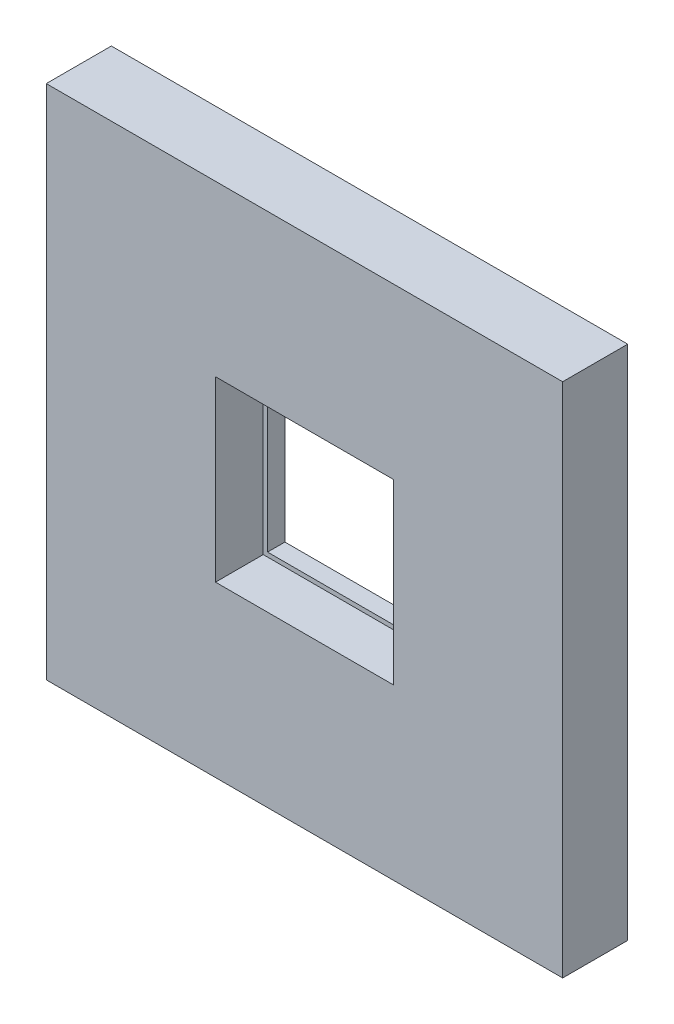
ISO-10303-21;
HEADER;
FILE_DESCRIPTION(('STEP AP214'),'2;1');
FILE_NAME('part.step','',(''),(''),'','','');
FILE_SCHEMA(('AUTOMOTIVE_DESIGN { 1 0 10303 214 1 1 1 1 }'));
ENDSEC;
DATA;
#1=APPLICATION_CONTEXT('core data for automotive mechanical design processes');
#2=APPLICATION_PROTOCOL_DEFINITION('international standard','automotive_design',2000,#1);
#3=PRODUCT_CONTEXT('',#1,'mechanical');
#4=PRODUCT('Part','Part','',(#3));
#5=PRODUCT_RELATED_PRODUCT_CATEGORY('part','',(#4));
#6=PRODUCT_DEFINITION_FORMATION('','',#4);
#7=PRODUCT_DEFINITION_CONTEXT('part definition',#1,'design');
#8=PRODUCT_DEFINITION('design','',#6,#7);
#9=PRODUCT_DEFINITION_SHAPE('','',#8);
#10=(LENGTH_UNIT() NAMED_UNIT(*) SI_UNIT(.MILLI.,.METRE.));
#11=(NAMED_UNIT(*) PLANE_ANGLE_UNIT() SI_UNIT($,.RADIAN.));
#12=(NAMED_UNIT(*) SI_UNIT($,.STERADIAN.) SOLID_ANGLE_UNIT());
#13=UNCERTAINTY_MEASURE_WITH_UNIT(LENGTH_MEASURE(1.E-05),#10,'distance_accuracy_value','');
#14=(GEOMETRIC_REPRESENTATION_CONTEXT(3) GLOBAL_UNCERTAINTY_ASSIGNED_CONTEXT((#13)) GLOBAL_UNIT_ASSIGNED_CONTEXT((#10,
#11,#12)) REPRESENTATION_CONTEXT('',''));
#15=CARTESIAN_POINT('',(0.,0.,0.));
#16=DIRECTION('',(0.,0.,1.));
#17=DIRECTION('',(1.,0.,0.));
#18=AXIS2_PLACEMENT_3D('',#15,#16,#17);
#19=CARTESIAN_POINT('',(-2.05,0.,0.4));
#20=DIRECTION('',(-1.,0.,0.));
#21=DIRECTION('',(0.,0.,1.));
#22=AXIS2_PLACEMENT_3D('',#19,#20,#21);
#23=PLANE('',#22);
#24=DIRECTION('',(0.,1.,0.));
#25=VECTOR('',#24,1.);
#26=CARTESIAN_POINT('',(-2.05,0.,0.));
#27=LINE('',#26,#25);
#28=CARTESIAN_POINT('',(-2.05,-2.05,0.));
#29=VERTEX_POINT('',#28);
#30=CARTESIAN_POINT('',(-2.05,2.05,0.));
#31=VERTEX_POINT('',#30);
#32=EDGE_CURVE('E169',#29,#31,#27,.T.);
#33=ORIENTED_EDGE('',*,*,#32,.F.);
#34=DIRECTION('',(0.,0.,-1.));
#35=VECTOR('',#34,1.);
#36=CARTESIAN_POINT('',(-2.05,-2.05,0.4));
#37=LINE('',#36,#35);
#38=CARTESIAN_POINT('',(-2.05,-2.05,0.4));
#39=VERTEX_POINT('',#38);
#40=EDGE_CURVE('E12',#39,#29,#37,.T.);
#41=ORIENTED_EDGE('',*,*,#40,.F.);
#42=DIRECTION('',(0.,1.,0.));
#43=VECTOR('',#42,1.);
#44=CARTESIAN_POINT('',(-2.05,0.,0.4));
#45=LINE('',#44,#43);
#46=CARTESIAN_POINT('',(-2.05,2.05,0.4));
#47=VERTEX_POINT('',#46);
#48=EDGE_CURVE('E140',#39,#47,#45,.T.);
#49=ORIENTED_EDGE('',*,*,#48,.T.);
#50=DIRECTION('',(0.,0.,-1.));
#51=VECTOR('',#50,1.);
#52=CARTESIAN_POINT('',(-2.05,2.05,0.4));
#53=LINE('',#52,#51);
#54=EDGE_CURVE('E74',#47,#31,#53,.T.);
#55=ORIENTED_EDGE('',*,*,#54,.T.);
#56=EDGE_LOOP('',(#33,#41,#49,#55));
#57=FACE_BOUND('',#56,.T.);
#58=ADVANCED_FACE('F55',(#57),#23,.T.);
#59=CARTESIAN_POINT('',(0.,-2.05,0.4));
#60=DIRECTION('',(0.,1.,0.));
#61=DIRECTION('',(0.,0.,1.));
#62=AXIS2_PLACEMENT_3D('',#59,#60,#61);
#63=PLANE('',#62);
#64=DIRECTION('',(1.,0.,0.));
#65=VECTOR('',#64,1.);
#66=CARTESIAN_POINT('',(0.,-2.05,0.));
#67=LINE('',#66,#65);
#68=CARTESIAN_POINT('',(2.05,-2.05,0.));
#69=VERTEX_POINT('',#68);
#70=EDGE_CURVE('E145',#29,#69,#67,.T.);
#71=ORIENTED_EDGE('',*,*,#70,.T.);
#72=DIRECTION('',(0.,0.,-1.));
#73=VECTOR('',#72,1.);
#74=CARTESIAN_POINT('',(2.05,-2.05,0.4));
#75=LINE('',#74,#73);
#76=CARTESIAN_POINT('',(2.05,-2.05,0.4));
#77=VERTEX_POINT('',#76);
#78=EDGE_CURVE('E65',#77,#69,#75,.T.);
#79=ORIENTED_EDGE('',*,*,#78,.F.);
#80=DIRECTION('',(1.,0.,0.));
#81=VECTOR('',#80,1.);
#82=CARTESIAN_POINT('',(0.,-2.05,0.4));
#83=LINE('',#82,#81);
#84=EDGE_CURVE('E135',#39,#77,#83,.T.);
#85=ORIENTED_EDGE('',*,*,#84,.F.);
#86=ORIENTED_EDGE('',*,*,#40,.T.);
#87=EDGE_LOOP('',(#71,#79,#85,#86));
#88=FACE_BOUND('',#87,.T.);
#89=ADVANCED_FACE('F143',(#88),#63,.F.);
#90=CARTESIAN_POINT('',(2.05,0.,0.4));
#91=DIRECTION('',(-1.,0.,0.));
#92=DIRECTION('',(0.,-1.,0.));
#93=AXIS2_PLACEMENT_3D('',#90,#91,#92);
#94=PLANE('',#93);
#95=DIRECTION('',(0.,1.,0.));
#96=VECTOR('',#95,1.);
#97=CARTESIAN_POINT('',(2.05,0.,0.));
#98=LINE('',#97,#96);
#99=CARTESIAN_POINT('',(2.05,2.05,0.));
#100=VERTEX_POINT('',#99);
#101=EDGE_CURVE('E166',#69,#100,#98,.T.);
#102=ORIENTED_EDGE('',*,*,#101,.T.);
#103=DIRECTION('',(0.,0.,-1.));
#104=VECTOR('',#103,1.);
#105=CARTESIAN_POINT('',(2.05,2.05,0.4));
#106=LINE('',#105,#104);
#107=CARTESIAN_POINT('',(2.05,2.05,0.4));
#108=VERTEX_POINT('',#107);
#109=EDGE_CURVE('E100',#108,#100,#106,.T.);
#110=ORIENTED_EDGE('',*,*,#109,.F.);
#111=DIRECTION('',(0.,1.,0.));
#112=VECTOR('',#111,1.);
#113=CARTESIAN_POINT('',(2.05,0.,0.4));
#114=LINE('',#113,#112);
#115=EDGE_CURVE('E127',#77,#108,#114,.T.);
#116=ORIENTED_EDGE('',*,*,#115,.F.);
#117=ORIENTED_EDGE('',*,*,#78,.T.);
#118=EDGE_LOOP('',(#102,#110,#116,#117));
#119=FACE_BOUND('',#118,.T.);
#120=ADVANCED_FACE('F129',(#119),#94,.F.);
#121=CARTESIAN_POINT('',(1.95,0.,0.4));
#122=DIRECTION('',(-1.,0.,0.));
#123=DIRECTION('',(0.,0.,1.));
#124=AXIS2_PLACEMENT_3D('',#121,#122,#123);
#125=PLANE('',#124);
#126=DIRECTION('',(0.,1.,0.));
#127=VECTOR('',#126,1.);
#128=CARTESIAN_POINT('',(1.95,0.,0.));
#129=LINE('',#128,#127);
#130=CARTESIAN_POINT('',(1.95,-1.95,0.));
#131=VERTEX_POINT('',#130);
#132=CARTESIAN_POINT('',(1.95,1.95,0.));
#133=VERTEX_POINT('',#132);
#134=EDGE_CURVE('E179',#131,#133,#129,.T.);
#135=ORIENTED_EDGE('',*,*,#134,.F.);
#136=DIRECTION('',(0.,0.,-1.));
#137=VECTOR('',#136,1.);
#138=CARTESIAN_POINT('',(1.95,-1.95,0.4));
#139=LINE('',#138,#137);
#140=CARTESIAN_POINT('',(1.95,-1.95,0.4));
#141=VERTEX_POINT('',#140);
#142=EDGE_CURVE('E59',#141,#131,#139,.T.);
#143=ORIENTED_EDGE('',*,*,#142,.F.);
#144=DIRECTION('',(0.,1.,0.));
#145=VECTOR('',#144,1.);
#146=CARTESIAN_POINT('',(1.95,0.,0.4));
#147=LINE('',#146,#145);
#148=CARTESIAN_POINT('',(1.95,1.95,0.4));
#149=VERTEX_POINT('',#148);
#150=EDGE_CURVE('E165',#141,#149,#147,.T.);
#151=ORIENTED_EDGE('',*,*,#150,.T.);
#152=DIRECTION('',(0.,0.,-1.));
#153=VECTOR('',#152,1.);
#154=CARTESIAN_POINT('',(1.95,1.95,0.4));
#155=LINE('',#154,#153);
#156=EDGE_CURVE('E150',#149,#133,#155,.T.);
#157=ORIENTED_EDGE('',*,*,#156,.T.);
#158=EDGE_LOOP('',(#135,#143,#151,#157));
#159=FACE_BOUND('',#158,.T.);
#160=ADVANCED_FACE('F57',(#159),#125,.T.);
#161=CARTESIAN_POINT('',(0.,-1.95,0.4));
#162=DIRECTION('',(0.,1.,0.));
#163=DIRECTION('',(0.,0.,1.));
#164=AXIS2_PLACEMENT_3D('',#161,#162,#163);
#165=PLANE('',#164);
#166=DIRECTION('',(1.,0.,0.));
#167=VECTOR('',#166,1.);
#168=CARTESIAN_POINT('',(0.,-1.95,0.));
#169=LINE('',#168,#167);
#170=CARTESIAN_POINT('',(-1.95,-1.95,0.));
#171=VERTEX_POINT('',#170);
#172=EDGE_CURVE('E176',#171,#131,#169,.T.);
#173=ORIENTED_EDGE('',*,*,#172,.F.);
#174=DIRECTION('',(0.,0.,-1.));
#175=VECTOR('',#174,1.);
#176=CARTESIAN_POINT('',(-1.95,-1.95,0.4));
#177=LINE('',#176,#175);
#178=CARTESIAN_POINT('',(-1.95,-1.95,0.4));
#179=VERTEX_POINT('',#178);
#180=EDGE_CURVE('E154',#179,#171,#177,.T.);
#181=ORIENTED_EDGE('',*,*,#180,.F.);
#182=DIRECTION('',(1.,0.,0.));
#183=VECTOR('',#182,1.);
#184=CARTESIAN_POINT('',(0.,-1.95,0.4));
#185=LINE('',#184,#183);
#186=EDGE_CURVE('E188',#179,#141,#185,.T.);
#187=ORIENTED_EDGE('',*,*,#186,.T.);
#188=ORIENTED_EDGE('',*,*,#142,.T.);
#189=EDGE_LOOP('',(#173,#181,#187,#188));
#190=FACE_BOUND('',#189,.T.);
#191=ADVANCED_FACE('F194',(#190),#165,.T.);
#192=CARTESIAN_POINT('',(-1.95,0.,0.4));
#193=DIRECTION('',(-1.,0.,0.));
#194=DIRECTION('',(0.,0.,1.));
#195=AXIS2_PLACEMENT_3D('',#192,#193,#194);
#196=PLANE('',#195);
#197=DIRECTION('',(0.,1.,0.));
#198=VECTOR('',#197,1.);
#199=CARTESIAN_POINT('',(-1.95,0.,0.));
#200=LINE('',#199,#198);
#201=CARTESIAN_POINT('',(-1.95,1.95,0.));
#202=VERTEX_POINT('',#201);
#203=EDGE_CURVE('E174',#171,#202,#200,.T.);
#204=ORIENTED_EDGE('',*,*,#203,.T.);
#205=DIRECTION('',(0.,0.,-1.));
#206=VECTOR('',#205,1.);
#207=CARTESIAN_POINT('',(-1.95,1.95,0.4));
#208=LINE('',#207,#206);
#209=CARTESIAN_POINT('',(-1.95,1.95,0.4));
#210=VERTEX_POINT('',#209);
#211=EDGE_CURVE('E152',#210,#202,#208,.T.);
#212=ORIENTED_EDGE('',*,*,#211,.F.);
#213=DIRECTION('',(0.,1.,0.));
#214=VECTOR('',#213,1.);
#215=CARTESIAN_POINT('',(-1.95,0.,0.4));
#216=LINE('',#215,#214);
#217=EDGE_CURVE('E186',#179,#210,#216,.T.);
#218=ORIENTED_EDGE('',*,*,#217,.F.);
#219=ORIENTED_EDGE('',*,*,#180,.T.);
#220=EDGE_LOOP('',(#204,#212,#218,#219));
#221=FACE_BOUND('',#220,.T.);
#222=ADVANCED_FACE('F196',(#221),#196,.F.);
#223=CARTESIAN_POINT('',(0.,1.95,0.4));
#224=DIRECTION('',(0.,1.,0.));
#225=DIRECTION('',(0.,0.,1.));
#226=AXIS2_PLACEMENT_3D('',#223,#224,#225);
#227=PLANE('',#226);
#228=DIRECTION('',(1.,0.,0.));
#229=VECTOR('',#228,1.);
#230=CARTESIAN_POINT('',(0.,1.95,0.));
#231=LINE('',#230,#229);
#232=EDGE_CURVE('E171',#202,#133,#231,.T.);
#233=ORIENTED_EDGE('',*,*,#232,.T.);
#234=ORIENTED_EDGE('',*,*,#156,.F.);
#235=DIRECTION('',(1.,0.,0.));
#236=VECTOR('',#235,1.);
#237=CARTESIAN_POINT('',(0.,1.95,0.4));
#238=LINE('',#237,#236);
#239=EDGE_CURVE('E184',#210,#149,#238,.T.);
#240=ORIENTED_EDGE('',*,*,#239,.F.);
#241=ORIENTED_EDGE('',*,*,#211,.T.);
#242=EDGE_LOOP('',(#233,#234,#240,#241));
#243=FACE_BOUND('',#242,.T.);
#244=ADVANCED_FACE('F199',(#243),#227,.F.);
#245=CARTESIAN_POINT('',(0.,2.05,0.4));
#246=DIRECTION('',(0.,1.,0.));
#247=DIRECTION('',(-1.,0.,0.));
#248=AXIS2_PLACEMENT_3D('',#245,#246,#247);
#249=PLANE('',#248);
#250=DIRECTION('',(1.,0.,0.));
#251=VECTOR('',#250,1.);
#252=CARTESIAN_POINT('',(0.,2.05,0.));
#253=LINE('',#252,#251);
#254=EDGE_CURVE('E162',#31,#100,#253,.T.);
#255=ORIENTED_EDGE('',*,*,#254,.F.);
#256=ORIENTED_EDGE('',*,*,#54,.F.);
#257=DIRECTION('',(1.,0.,0.));
#258=VECTOR('',#257,1.);
#259=CARTESIAN_POINT('',(0.,2.05,0.4));
#260=LINE('',#259,#258);
#261=EDGE_CURVE('E134',#47,#108,#260,.T.);
#262=ORIENTED_EDGE('',*,*,#261,.T.);
#263=ORIENTED_EDGE('',*,*,#109,.T.);
#264=EDGE_LOOP('',(#255,#256,#262,#263));
#265=FACE_BOUND('',#264,.T.);
#266=ADVANCED_FACE('F205',(#265),#249,.T.);
#267=CARTESIAN_POINT('',(0.,0.,0.4));
#268=DIRECTION('',(0.,0.,1.));
#269=DIRECTION('',(1.,0.,0.));
#270=AXIS2_PLACEMENT_3D('',#267,#268,#269);
#271=PLANE('',#270);
#272=ORIENTED_EDGE('',*,*,#150,.F.);
#273=ORIENTED_EDGE('',*,*,#186,.F.);
#274=ORIENTED_EDGE('',*,*,#217,.T.);
#275=ORIENTED_EDGE('',*,*,#239,.T.);
#276=EDGE_LOOP('',(#272,#273,#274,#275));
#277=FACE_BOUND('',#276,.T.);
#278=ORIENTED_EDGE('',*,*,#48,.F.);
#279=ORIENTED_EDGE('',*,*,#84,.T.);
#280=ORIENTED_EDGE('',*,*,#115,.T.);
#281=ORIENTED_EDGE('',*,*,#261,.F.);
#282=EDGE_LOOP('',(#278,#279,#280,#281));
#283=FACE_BOUND('',#282,.T.);
#284=ADVANCED_FACE('F139',(#277,#283),#271,.T.);
#285=CARTESIAN_POINT('',(0.,0.,0.));
#286=DIRECTION('',(0.,0.,1.));
#287=DIRECTION('',(1.,0.,0.));
#288=AXIS2_PLACEMENT_3D('',#285,#286,#287);
#289=PLANE('',#288);
#290=ORIENTED_EDGE('',*,*,#134,.T.);
#291=ORIENTED_EDGE('',*,*,#232,.F.);
#292=ORIENTED_EDGE('',*,*,#203,.F.);
#293=ORIENTED_EDGE('',*,*,#172,.T.);
#294=EDGE_LOOP('',(#290,#291,#292,#293));
#295=FACE_BOUND('',#294,.T.);
#296=ORIENTED_EDGE('',*,*,#32,.T.);
#297=ORIENTED_EDGE('',*,*,#254,.T.);
#298=ORIENTED_EDGE('',*,*,#101,.F.);
#299=ORIENTED_EDGE('',*,*,#70,.F.);
#300=EDGE_LOOP('',(#296,#297,#298,#299));
#301=FACE_BOUND('',#300,.T.);
#302=ADVANCED_FACE('F201',(#295,#301),#289,.F.);
#303=CLOSED_SHELL('',(#58,#89,#120,#160,#191,#222,#244,#266,#284,#302));
#304=MANIFOLD_SOLID_BREP('B2',#303);
#305=CARTESIAN_POINT('',(-5.95,0.,1.5));
#306=DIRECTION('',(-1.,0.,0.));
#307=DIRECTION('',(0.,0.,1.));
#308=AXIS2_PLACEMENT_3D('',#305,#306,#307);
#309=PLANE('',#308);
#310=DIRECTION('',(0.,1.,0.));
#311=VECTOR('',#310,1.);
#312=CARTESIAN_POINT('',(-5.95,0.,0.));
#313=LINE('',#312,#311);
#314=CARTESIAN_POINT('',(-5.95,-5.95,0.));
#315=VERTEX_POINT('',#314);
#316=CARTESIAN_POINT('',(-5.95,5.95,0.));
#317=VERTEX_POINT('',#316);
#318=EDGE_CURVE('E433',#315,#317,#313,.T.);
#319=ORIENTED_EDGE('',*,*,#318,.F.);
#320=DIRECTION('',(0.,0.,-1.));
#321=VECTOR('',#320,1.);
#322=CARTESIAN_POINT('',(-5.95,-5.95,1.5));
#323=LINE('',#322,#321);
#324=CARTESIAN_POINT('',(-5.95,-5.95,1.5));
#325=VERTEX_POINT('',#324);
#326=EDGE_CURVE('E53',#325,#315,#323,.T.);
#327=ORIENTED_EDGE('',*,*,#326,.F.);
#328=DIRECTION('',(0.,1.,0.));
#329=VECTOR('',#328,1.);
#330=CARTESIAN_POINT('',(-5.95,0.,1.5));
#331=LINE('',#330,#329);
#332=CARTESIAN_POINT('',(-5.95,5.95,1.5));
#333=VERTEX_POINT('',#332);
#334=EDGE_CURVE('E392',#325,#333,#331,.T.);
#335=ORIENTED_EDGE('',*,*,#334,.T.);
#336=DIRECTION('',(0.,0.,-1.));
#337=VECTOR('',#336,1.);
#338=CARTESIAN_POINT('',(-5.95,5.95,1.5));
#339=LINE('',#338,#337);
#340=EDGE_CURVE('E325',#333,#317,#339,.T.);
#341=ORIENTED_EDGE('',*,*,#340,.T.);
#342=EDGE_LOOP('',(#319,#327,#335,#341));
#343=FACE_BOUND('',#342,.T.);
#344=ADVANCED_FACE('F305',(#343),#309,.T.);
#345=CARTESIAN_POINT('',(0.,-5.95,1.5));
#346=DIRECTION('',(0.,1.,0.));
#347=DIRECTION('',(0.,0.,1.));
#348=AXIS2_PLACEMENT_3D('',#345,#346,#347);
#349=PLANE('',#348);
#350=DIRECTION('',(1.,0.,0.));
#351=VECTOR('',#350,1.);
#352=CARTESIAN_POINT('',(0.,-5.95,0.));
#353=LINE('',#352,#351);
#354=CARTESIAN_POINT('',(5.95,-5.95,0.));
#355=VERTEX_POINT('',#354);
#356=EDGE_CURVE('E398',#315,#355,#353,.T.);
#357=ORIENTED_EDGE('',*,*,#356,.T.);
#358=DIRECTION('',(0.,0.,-1.));
#359=VECTOR('',#358,1.);
#360=CARTESIAN_POINT('',(5.95,-5.95,1.5));
#361=LINE('',#360,#359);
#362=CARTESIAN_POINT('',(5.95,-5.95,1.5));
#363=VERTEX_POINT('',#362);
#364=EDGE_CURVE('E316',#363,#355,#361,.T.);
#365=ORIENTED_EDGE('',*,*,#364,.F.);
#366=DIRECTION('',(1.,0.,0.));
#367=VECTOR('',#366,1.);
#368=CARTESIAN_POINT('',(0.,-5.95,1.5));
#369=LINE('',#368,#367);
#370=EDGE_CURVE('E387',#325,#363,#369,.T.);
#371=ORIENTED_EDGE('',*,*,#370,.F.);
#372=ORIENTED_EDGE('',*,*,#326,.T.);
#373=EDGE_LOOP('',(#357,#365,#371,#372));
#374=FACE_BOUND('',#373,.T.);
#375=ADVANCED_FACE('F396',(#374),#349,.F.);
#376=CARTESIAN_POINT('',(5.95,0.,1.5));
#377=DIRECTION('',(-1.,0.,0.));
#378=DIRECTION('',(0.,-1.,0.));
#379=AXIS2_PLACEMENT_3D('',#376,#377,#378);
#380=PLANE('',#379);
#381=DIRECTION('',(0.,1.,0.));
#382=VECTOR('',#381,1.);
#383=CARTESIAN_POINT('',(5.95,0.,0.));
#384=LINE('',#383,#382);
#385=CARTESIAN_POINT('',(5.95,5.95,0.));
#386=VERTEX_POINT('',#385);
#387=EDGE_CURVE('E428',#355,#386,#384,.T.);
#388=ORIENTED_EDGE('',*,*,#387,.T.);
#389=DIRECTION('',(0.,0.,-1.));
#390=VECTOR('',#389,1.);
#391=CARTESIAN_POINT('',(5.95,5.95,1.5));
#392=LINE('',#391,#390);
#393=CARTESIAN_POINT('',(5.95,5.95,1.5));
#394=VERTEX_POINT('',#393);
#395=EDGE_CURVE('E351',#394,#386,#392,.T.);
#396=ORIENTED_EDGE('',*,*,#395,.F.);
#397=DIRECTION('',(0.,1.,0.));
#398=VECTOR('',#397,1.);
#399=CARTESIAN_POINT('',(5.95,0.,1.5));
#400=LINE('',#399,#398);
#401=EDGE_CURVE('E378',#363,#394,#400,.T.);
#402=ORIENTED_EDGE('',*,*,#401,.F.);
#403=ORIENTED_EDGE('',*,*,#364,.T.);
#404=EDGE_LOOP('',(#388,#396,#402,#403));
#405=FACE_BOUND('',#404,.T.);
#406=ADVANCED_FACE('F380',(#405),#380,.F.);
#407=CARTESIAN_POINT('',(0.,-2.05,1.5));
#408=DIRECTION('',(0.,1.,0.));
#409=DIRECTION('',(0.,0.,1.));
#410=AXIS2_PLACEMENT_3D('',#407,#408,#409);
#411=PLANE('',#410);
#412=DIRECTION('',(1.,0.,0.));
#413=VECTOR('',#412,1.);
#414=CARTESIAN_POINT('',(0.,-2.05,0.));
#415=LINE('',#414,#413);
#416=CARTESIAN_POINT('',(-2.05,-2.05,0.));
#417=VERTEX_POINT('',#416);
#418=CARTESIAN_POINT('',(2.05,-2.05,0.));
#419=VERTEX_POINT('',#418);
#420=EDGE_CURVE('E446',#417,#419,#415,.T.);
#421=ORIENTED_EDGE('',*,*,#420,.F.);
#422=DIRECTION('',(0.,0.,-1.));
#423=VECTOR('',#422,1.);
#424=CARTESIAN_POINT('',(-2.05,-2.05,1.5));
#425=LINE('',#424,#423);
#426=CARTESIAN_POINT('',(-2.05,-2.05,1.5));
#427=VERTEX_POINT('',#426);
#428=EDGE_CURVE('E309',#427,#417,#425,.T.);
#429=ORIENTED_EDGE('',*,*,#428,.F.);
#430=DIRECTION('',(1.,0.,0.));
#431=VECTOR('',#430,1.);
#432=CARTESIAN_POINT('',(0.,-2.05,1.5));
#433=LINE('',#432,#431);
#434=CARTESIAN_POINT('',(2.05,-2.05,1.5));
#435=VERTEX_POINT('',#434);
#436=EDGE_CURVE('E427',#427,#435,#433,.T.);
#437=ORIENTED_EDGE('',*,*,#436,.T.);
#438=DIRECTION('',(0.,0.,-1.));
#439=VECTOR('',#438,1.);
#440=CARTESIAN_POINT('',(2.05,-2.05,1.5));
#441=LINE('',#440,#439);
#442=EDGE_CURVE('E405',#435,#419,#441,.T.);
#443=ORIENTED_EDGE('',*,*,#442,.T.);
#444=EDGE_LOOP('',(#421,#429,#437,#443));
#445=FACE_BOUND('',#444,.T.);
#446=ADVANCED_FACE('F307',(#445),#411,.T.);
#447=CARTESIAN_POINT('',(-2.05,0.,1.5));
#448=DIRECTION('',(-1.,0.,0.));
#449=DIRECTION('',(0.,0.,1.));
#450=AXIS2_PLACEMENT_3D('',#447,#448,#449);
#451=PLANE('',#450);
#452=DIRECTION('',(0.,1.,0.));
#453=VECTOR('',#452,1.);
#454=CARTESIAN_POINT('',(-2.05,0.,0.));
#455=LINE('',#454,#453);
#456=CARTESIAN_POINT('',(-2.05,2.05,0.));
#457=VERTEX_POINT('',#456);
#458=EDGE_CURVE('E443',#417,#457,#455,.T.);
#459=ORIENTED_EDGE('',*,*,#458,.T.);
#460=DIRECTION('',(0.,0.,-1.));
#461=VECTOR('',#460,1.);
#462=CARTESIAN_POINT('',(-2.05,2.05,1.5));
#463=LINE('',#462,#461);
#464=CARTESIAN_POINT('',(-2.05,2.05,1.5));
#465=VERTEX_POINT('',#464);
#466=EDGE_CURVE('E410',#465,#457,#463,.T.);
#467=ORIENTED_EDGE('',*,*,#466,.F.);
#468=DIRECTION('',(0.,1.,0.));
#469=VECTOR('',#468,1.);
#470=CARTESIAN_POINT('',(-2.05,0.,1.5));
#471=LINE('',#470,#469);
#472=EDGE_CURVE('E461',#427,#465,#471,.T.);
#473=ORIENTED_EDGE('',*,*,#472,.F.);
#474=ORIENTED_EDGE('',*,*,#428,.T.);
#475=EDGE_LOOP('',(#459,#467,#473,#474));
#476=FACE_BOUND('',#475,.T.);
#477=ADVANCED_FACE('F475',(#476),#451,.F.);
#478=CARTESIAN_POINT('',(0.,2.05,1.5));
#479=DIRECTION('',(0.,1.,0.));
#480=DIRECTION('',(-1.,0.,0.));
#481=AXIS2_PLACEMENT_3D('',#478,#479,#480);
#482=PLANE('',#481);
#483=DIRECTION('',(1.,0.,0.));
#484=VECTOR('',#483,1.);
#485=CARTESIAN_POINT('',(0.,2.05,0.));
#486=LINE('',#485,#484);
#487=CARTESIAN_POINT('',(2.05,2.05,0.));
#488=VERTEX_POINT('',#487);
#489=EDGE_CURVE('E440',#457,#488,#486,.T.);
#490=ORIENTED_EDGE('',*,*,#489,.T.);
#491=DIRECTION('',(0.,0.,-1.));
#492=VECTOR('',#491,1.);
#493=CARTESIAN_POINT('',(2.05,2.05,1.5));
#494=LINE('',#493,#492);
#495=CARTESIAN_POINT('',(2.05,2.05,1.5));
#496=VERTEX_POINT('',#495);
#497=EDGE_CURVE('E408',#496,#488,#494,.T.);
#498=ORIENTED_EDGE('',*,*,#497,.F.);
#499=DIRECTION('',(1.,0.,0.));
#500=VECTOR('',#499,1.);
#501=CARTESIAN_POINT('',(0.,2.05,1.5));
#502=LINE('',#501,#500);
#503=EDGE_CURVE('E458',#465,#496,#502,.T.);
#504=ORIENTED_EDGE('',*,*,#503,.F.);
#505=ORIENTED_EDGE('',*,*,#466,.T.);
#506=EDGE_LOOP('',(#490,#498,#504,#505));
#507=FACE_BOUND('',#506,.T.);
#508=ADVANCED_FACE('F476',(#507),#482,.F.);
#509=CARTESIAN_POINT('',(2.05,0.,1.5));
#510=DIRECTION('',(-1.,0.,0.));
#511=DIRECTION('',(0.,-1.,0.));
#512=AXIS2_PLACEMENT_3D('',#509,#510,#511);
#513=PLANE('',#512);
#514=DIRECTION('',(0.,1.,0.));
#515=VECTOR('',#514,1.);
#516=CARTESIAN_POINT('',(2.05,0.,0.));
#517=LINE('',#516,#515);
#518=EDGE_CURVE('E436',#419,#488,#517,.T.);
#519=ORIENTED_EDGE('',*,*,#518,.F.);
#520=ORIENTED_EDGE('',*,*,#442,.F.);
#521=DIRECTION('',(0.,1.,0.));
#522=VECTOR('',#521,1.);
#523=CARTESIAN_POINT('',(2.05,0.,1.5));
#524=LINE('',#523,#522);
#525=EDGE_CURVE('E454',#435,#496,#524,.T.);
#526=ORIENTED_EDGE('',*,*,#525,.T.);
#527=ORIENTED_EDGE('',*,*,#497,.T.);
#528=EDGE_LOOP('',(#519,#520,#526,#527));
#529=FACE_BOUND('',#528,.T.);
#530=ADVANCED_FACE('F471',(#529),#513,.T.);
#531=CARTESIAN_POINT('',(0.,5.95,1.5));
#532=DIRECTION('',(0.,1.,0.));
#533=DIRECTION('',(-1.,0.,0.));
#534=AXIS2_PLACEMENT_3D('',#531,#532,#533);
#535=PLANE('',#534);
#536=DIRECTION('',(1.,0.,0.));
#537=VECTOR('',#536,1.);
#538=CARTESIAN_POINT('',(0.,5.95,0.));
#539=LINE('',#538,#537);
#540=EDGE_CURVE('E423',#317,#386,#539,.T.);
#541=ORIENTED_EDGE('',*,*,#540,.F.);
#542=ORIENTED_EDGE('',*,*,#340,.F.);
#543=DIRECTION('',(1.,0.,0.));
#544=VECTOR('',#543,1.);
#545=CARTESIAN_POINT('',(0.,5.95,1.5));
#546=LINE('',#545,#544);
#547=EDGE_CURVE('E386',#333,#394,#546,.T.);
#548=ORIENTED_EDGE('',*,*,#547,.T.);
#549=ORIENTED_EDGE('',*,*,#395,.T.);
#550=EDGE_LOOP('',(#541,#542,#548,#549));
#551=FACE_BOUND('',#550,.T.);
#552=ADVANCED_FACE('F483',(#551),#535,.T.);
#553=CARTESIAN_POINT('',(0.,0.,1.5));
#554=DIRECTION('',(0.,0.,1.));
#555=DIRECTION('',(1.,0.,0.));
#556=AXIS2_PLACEMENT_3D('',#553,#554,#555);
#557=PLANE('',#556);
#558=ORIENTED_EDGE('',*,*,#436,.F.);
#559=ORIENTED_EDGE('',*,*,#472,.T.);
#560=ORIENTED_EDGE('',*,*,#503,.T.);
#561=ORIENTED_EDGE('',*,*,#525,.F.);
#562=EDGE_LOOP('',(#558,#559,#560,#561));
#563=FACE_BOUND('',#562,.T.);
#564=ORIENTED_EDGE('',*,*,#334,.F.);
#565=ORIENTED_EDGE('',*,*,#370,.T.);
#566=ORIENTED_EDGE('',*,*,#401,.T.);
#567=ORIENTED_EDGE('',*,*,#547,.F.);
#568=EDGE_LOOP('',(#564,#565,#566,#567));
#569=FACE_BOUND('',#568,.T.);
#570=ADVANCED_FACE('F391',(#563,#569),#557,.T.);
#571=CARTESIAN_POINT('',(0.,0.,0.));
#572=DIRECTION('',(0.,0.,1.));
#573=DIRECTION('',(1.,0.,0.));
#574=AXIS2_PLACEMENT_3D('',#571,#572,#573);
#575=PLANE('',#574);
#576=ORIENTED_EDGE('',*,*,#420,.T.);
#577=ORIENTED_EDGE('',*,*,#518,.T.);
#578=ORIENTED_EDGE('',*,*,#489,.F.);
#579=ORIENTED_EDGE('',*,*,#458,.F.);
#580=EDGE_LOOP('',(#576,#577,#578,#579));
#581=FACE_BOUND('',#580,.T.);
#582=ORIENTED_EDGE('',*,*,#318,.T.);
#583=ORIENTED_EDGE('',*,*,#540,.T.);
#584=ORIENTED_EDGE('',*,*,#387,.F.);
#585=ORIENTED_EDGE('',*,*,#356,.F.);
#586=EDGE_LOOP('',(#582,#583,#584,#585));
#587=FACE_BOUND('',#586,.T.);
#588=ADVANCED_FACE('F473',(#581,#587),#575,.F.);
#589=CLOSED_SHELL('',(#344,#375,#406,#446,#477,#508,#530,#552,#570,#588));
#590=MANIFOLD_SOLID_BREP('B6',#589);
#591=ADVANCED_BREP_SHAPE_REPRESENTATION('',(#18,#304,#590),#14);
#592=SHAPE_DEFINITION_REPRESENTATION(#9,#591);
ENDSEC;
END-ISO-10303-21;
